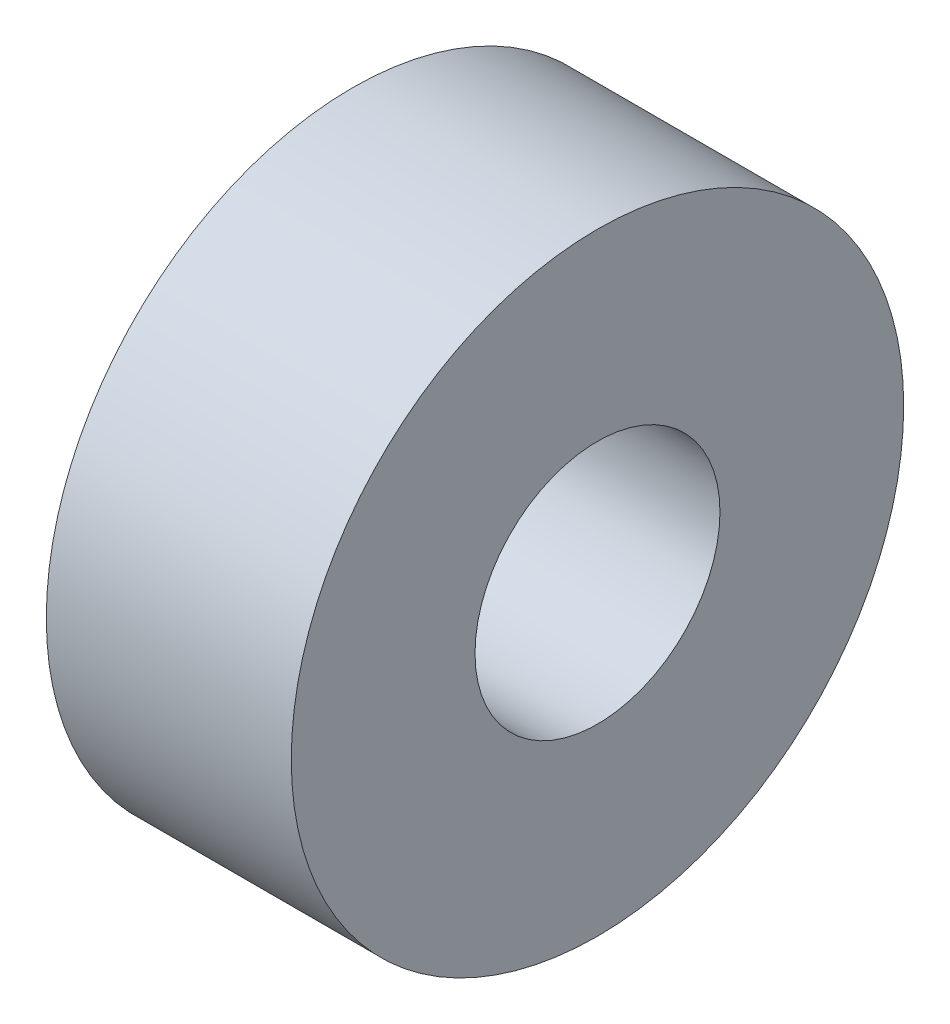
ISO-10303-21;
HEADER;
FILE_DESCRIPTION(('STEP AP214'),'2;1');
FILE_NAME('part.step','',(''),(''),'','','');
FILE_SCHEMA(('AUTOMOTIVE_DESIGN { 1 0 10303 214 1 1 1 1 }'));
ENDSEC;
DATA;
#1=APPLICATION_CONTEXT('core data for automotive mechanical design processes');
#2=APPLICATION_PROTOCOL_DEFINITION('international standard','automotive_design',2000,#1);
#3=PRODUCT_CONTEXT('',#1,'mechanical');
#4=PRODUCT('Part','Part','',(#3));
#5=PRODUCT_RELATED_PRODUCT_CATEGORY('part','',(#4));
#6=PRODUCT_DEFINITION_FORMATION('','',#4);
#7=PRODUCT_DEFINITION_CONTEXT('part definition',#1,'design');
#8=PRODUCT_DEFINITION('design','',#6,#7);
#9=PRODUCT_DEFINITION_SHAPE('','',#8);
#10=(LENGTH_UNIT() NAMED_UNIT(*) SI_UNIT(.MILLI.,.METRE.));
#11=(NAMED_UNIT(*) PLANE_ANGLE_UNIT() SI_UNIT($,.RADIAN.));
#12=(NAMED_UNIT(*) SI_UNIT($,.STERADIAN.) SOLID_ANGLE_UNIT());
#13=UNCERTAINTY_MEASURE_WITH_UNIT(LENGTH_MEASURE(1.E-05),#10,'distance_accuracy_value','');
#14=(GEOMETRIC_REPRESENTATION_CONTEXT(3) GLOBAL_UNCERTAINTY_ASSIGNED_CONTEXT((#13)) GLOBAL_UNIT_ASSIGNED_CONTEXT((#10,
#11,#12)) REPRESENTATION_CONTEXT('',''));
#15=CARTESIAN_POINT('',(0.,0.,0.));
#16=DIRECTION('',(0.,0.,1.));
#17=DIRECTION('',(1.,0.,0.));
#18=AXIS2_PLACEMENT_3D('',#15,#16,#17);
#19=CARTESIAN_POINT('',(3.,12.5,0.));
#20=DIRECTION('',(1.,0.,0.));
#21=DIRECTION('',(0.,0.,-1.));
#22=AXIS2_PLACEMENT_3D('',#19,#20,#21);
#23=PLANE('',#22);
#24=CARTESIAN_POINT('',(3.,0.,0.));
#25=DIRECTION('',(-1.,0.,0.));
#26=DIRECTION('',(0.,0.,1.));
#27=AXIS2_PLACEMENT_3D('',#24,#25,#26);
#28=CIRCLE('',#27,5.);
#29=CARTESIAN_POINT('',(3.,0.,5.));
#30=VERTEX_POINT('',#29);
#31=EDGE_CURVE('E10',#30,#30,#28,.T.);
#32=ORIENTED_EDGE('',*,*,#31,.F.);
#33=EDGE_LOOP('',(#32));
#34=FACE_BOUND('',#33,.T.);
#35=CARTESIAN_POINT('',(3.,0.,0.));
#36=DIRECTION('',(-1.,0.,0.));
#37=DIRECTION('',(0.,0.,1.));
#38=AXIS2_PLACEMENT_3D('',#35,#36,#37);
#39=CIRCLE('',#38,12.5);
#40=CARTESIAN_POINT('',(3.,0.,12.5));
#41=VERTEX_POINT('',#40);
#42=EDGE_CURVE('E46',#41,#41,#39,.T.);
#43=ORIENTED_EDGE('',*,*,#42,.T.);
#44=EDGE_LOOP('',(#43));
#45=FACE_BOUND('',#44,.T.);
#46=ADVANCED_FACE('F32',(#34,#45),#23,.F.);
#47=CARTESIAN_POINT('',(0.,0.,0.));
#48=DIRECTION('',(-1.,0.,0.));
#49=DIRECTION('',(0.,0.,1.));
#50=AXIS2_PLACEMENT_3D('',#47,#48,#49);
#51=CYLINDRICAL_SURFACE('',#50,5.);
#52=CARTESIAN_POINT('',(13.,0.,0.));
#53=DIRECTION('',(-1.,0.,0.));
#54=DIRECTION('',(0.,0.,1.));
#55=AXIS2_PLACEMENT_3D('',#52,#53,#54);
#56=CIRCLE('',#55,5.);
#57=CARTESIAN_POINT('',(13.,0.,5.));
#58=VERTEX_POINT('',#57);
#59=EDGE_CURVE('E38',#58,#58,#56,.T.);
#60=ORIENTED_EDGE('',*,*,#59,.F.);
#61=EDGE_LOOP('',(#60));
#62=FACE_BOUND('',#61,.T.);
#63=ORIENTED_EDGE('',*,*,#31,.T.);
#64=EDGE_LOOP('',(#63));
#65=FACE_BOUND('',#64,.T.);
#66=ADVANCED_FACE('F61',(#62,#65),#51,.F.);
#67=CARTESIAN_POINT('',(13.,12.5,0.));
#68=DIRECTION('',(-1.,0.,0.));
#69=DIRECTION('',(0.,0.,1.));
#70=AXIS2_PLACEMENT_3D('',#67,#68,#69);
#71=PLANE('',#70);
#72=CARTESIAN_POINT('',(13.,0.,0.));
#73=DIRECTION('',(-1.,0.,0.));
#74=DIRECTION('',(0.,0.,1.));
#75=AXIS2_PLACEMENT_3D('',#72,#73,#74);
#76=CIRCLE('',#75,12.5);
#77=CARTESIAN_POINT('',(13.,0.,12.5));
#78=VERTEX_POINT('',#77);
#79=EDGE_CURVE('E42',#78,#78,#76,.T.);
#80=ORIENTED_EDGE('',*,*,#79,.F.);
#81=EDGE_LOOP('',(#80));
#82=FACE_BOUND('',#81,.T.);
#83=ORIENTED_EDGE('',*,*,#59,.T.);
#84=EDGE_LOOP('',(#83));
#85=FACE_BOUND('',#84,.T.);
#86=ADVANCED_FACE('F56',(#82,#85),#71,.F.);
#87=CARTESIAN_POINT('',(0.,0.,0.));
#88=DIRECTION('',(-1.,0.,0.));
#89=DIRECTION('',(0.,0.,1.));
#90=AXIS2_PLACEMENT_3D('',#87,#88,#89);
#91=CYLINDRICAL_SURFACE('',#90,12.5);
#92=ORIENTED_EDGE('',*,*,#42,.F.);
#93=EDGE_LOOP('',(#92));
#94=FACE_BOUND('',#93,.T.);
#95=ORIENTED_EDGE('',*,*,#79,.T.);
#96=EDGE_LOOP('',(#95));
#97=FACE_BOUND('',#96,.T.);
#98=ADVANCED_FACE('F53',(#94,#97),#91,.T.);
#99=CLOSED_SHELL('',(#46,#66,#86,#98));
#100=MANIFOLD_SOLID_BREP('B2',#99);
#101=ADVANCED_BREP_SHAPE_REPRESENTATION('',(#18,#100),#14);
#102=SHAPE_DEFINITION_REPRESENTATION(#9,#101);
ENDSEC;
END-ISO-10303-21;
